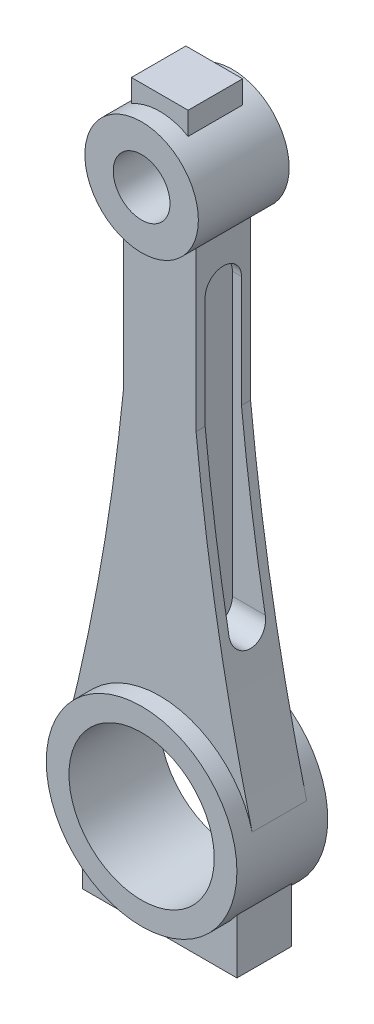
ISO-10303-21;
HEADER;
FILE_DESCRIPTION(('STEP AP214'),'2;1');
FILE_NAME('part.step','',(''),(''),'','','');
FILE_SCHEMA(('AUTOMOTIVE_DESIGN { 1 0 10303 214 1 1 1 1 }'));
ENDSEC;
DATA;
#1=APPLICATION_CONTEXT('core data for automotive mechanical design processes');
#2=APPLICATION_PROTOCOL_DEFINITION('international standard','automotive_design',2000,#1);
#3=PRODUCT_CONTEXT('',#1,'mechanical');
#4=PRODUCT('Part','Part','',(#3));
#5=PRODUCT_RELATED_PRODUCT_CATEGORY('part','',(#4));
#6=PRODUCT_DEFINITION_FORMATION('','',#4);
#7=PRODUCT_DEFINITION_CONTEXT('part definition',#1,'design');
#8=PRODUCT_DEFINITION('design','',#6,#7);
#9=PRODUCT_DEFINITION_SHAPE('','',#8);
#10=(LENGTH_UNIT() NAMED_UNIT(*) SI_UNIT(.MILLI.,.METRE.));
#11=(NAMED_UNIT(*) PLANE_ANGLE_UNIT() SI_UNIT($,.RADIAN.));
#12=(NAMED_UNIT(*) SI_UNIT($,.STERADIAN.) SOLID_ANGLE_UNIT());
#13=UNCERTAINTY_MEASURE_WITH_UNIT(LENGTH_MEASURE(1.E-05),#10,'distance_accuracy_value','');
#14=(GEOMETRIC_REPRESENTATION_CONTEXT(3) GLOBAL_UNCERTAINTY_ASSIGNED_CONTEXT((#13)) GLOBAL_UNIT_ASSIGNED_CONTEXT((#10,
#11,#12)) REPRESENTATION_CONTEXT('',''));
#15=CARTESIAN_POINT('',(0.,0.,0.));
#16=DIRECTION('',(0.,0.,1.));
#17=DIRECTION('',(1.,0.,0.));
#18=AXIS2_PLACEMENT_3D('',#15,#16,#17);
#19=CARTESIAN_POINT('',(485.609961130753,123.214585182197,6.));
#20=DIRECTION('',(0.,0.,-1.));
#21=DIRECTION('',(-1.,0.,0.));
#22=AXIS2_PLACEMENT_3D('',#19,#20,#21);
#23=CYLINDRICAL_SURFACE('',#22,479.997872601303);
#24=CARTESIAN_POINT('',(13.2367694972697,38.,-4.00000000000001));
#25=CARTESIAN_POINT('',(13.2573253969701,37.8860494352849,-4.00000976035226));
#26=CARTESIAN_POINT('',(13.2779224354355,37.7721113381636,-3.99513071215658));
#27=CARTESIAN_POINT('',(13.319052010866,37.5450569105739,-3.97567481804759));
#28=CARTESIAN_POINT('',(13.3395845492554,37.4319405618855,-3.96109818781723));
#29=CARTESIAN_POINT('',(13.3804339454306,37.2073506135732,-3.92233199810353));
#30=CARTESIAN_POINT('',(13.400750858069,37.0958765932167,-3.89814494664777));
#31=CARTESIAN_POINT('',(13.4410189163302,36.8753687223466,-3.84034033341715));
#32=CARTESIAN_POINT('',(13.4609700679236,36.7663348319936,-3.80672292573126));
#33=CARTESIAN_POINT('',(13.5200780992815,36.4439244011923,-3.69196014641538));
#34=CARTESIAN_POINT('',(13.5585015813534,36.235173020896,-3.59689277281704));
#35=CARTESIAN_POINT('',(13.632098352802,35.8366935291636,-3.37230858466554));
#36=CARTESIAN_POINT('',(13.667272642268,35.6469595626994,-3.24280241816722));
#37=CARTESIAN_POINT('',(13.7330571386943,35.2931579860129,-2.9537766741925));
#38=CARTESIAN_POINT('',(13.7636967389675,35.1289247082108,-2.79446705193569));
#39=CARTESIAN_POINT('',(13.8196728199873,34.829604441335,-2.4496372532524));
#40=CARTESIAN_POINT('',(13.8450088675232,34.6945198331874,-2.26411493776325));
#41=CARTESIAN_POINT('',(13.8891384890161,34.459656916781,-1.87529532046205));
#42=CARTESIAN_POINT('',(13.9080297897631,34.3593508125007,-1.6723279831204));
#43=CARTESIAN_POINT('',(13.9391556835637,34.194272351098,-1.25196201869724));
#44=CARTESIAN_POINT('',(13.9513913483916,34.1294942727913,-1.03456572147865));
#45=CARTESIAN_POINT('',(13.9686323879057,34.0382606103888,-0.59514241969184));
#46=CARTESIAN_POINT('',(13.9737473641708,34.0112240902681,-0.3732402045156));
#47=CARTESIAN_POINT('',(13.976920463438,33.9944488111073,0.0720189558451219));
#48=CARTESIAN_POINT('',(13.9749788383574,34.0047087206018,0.295375848814119));
#49=CARTESIAN_POINT('',(13.9641500072665,34.0619779758205,0.735421312346313));
#50=CARTESIAN_POINT('',(13.9553155030014,34.108708474586,0.952147568523602));
#51=CARTESIAN_POINT('',(13.9310734089588,34.2371227885846,1.37458854633153));
#52=CARTESIAN_POINT('',(13.9156657846489,34.3188067874484,1.58030321010563));
#53=CARTESIAN_POINT('',(13.8787244160883,34.5150475837361,1.97586856318911));
#54=CARTESIAN_POINT('',(13.8571654875107,34.6297395375632,2.1656497970732));
#55=CARTESIAN_POINT('',(13.8086626922934,34.8884296176294,2.52325934039983));
#56=CARTESIAN_POINT('',(13.7817187651744,35.0324280730121,2.69108740324973));
#57=CARTESIAN_POINT('',(13.7229065779148,35.3476889783691,3.00249885656432));
#58=CARTESIAN_POINT('',(13.690976829032,35.5192928072897,3.14572490036054));
#59=CARTESIAN_POINT('',(13.6234451288193,35.8834872510315,3.40145531805111));
#60=CARTESIAN_POINT('',(13.5878417058661,36.0760862779984,3.5139473139706));
#61=CARTESIAN_POINT('',(13.5134059314584,36.4802597435099,3.70694341195726));
#62=CARTESIAN_POINT('',(13.4745286819557,36.6921029237947,3.78686594783111));
#63=CARTESIAN_POINT('',(13.395259384564,37.1257849194858,3.90978182018943));
#64=CARTESIAN_POINT('',(13.354869587446,37.3476089746237,3.9528279173078));
#65=CARTESIAN_POINT('',(13.3014087361752,37.6424264183624,3.98463413203901));
#66=CARTESIAN_POINT('',(13.2884679030868,37.7138831380064,3.99039941838274));
#67=CARTESIAN_POINT('',(13.2626042087633,37.8568827970625,3.99807716864509));
#68=CARTESIAN_POINT('',(13.2496813536875,37.9284253921545,3.99999606304932));
#69=CARTESIAN_POINT('',(13.2367694972696,38.,3.99999999999999));
#70=B_SPLINE_CURVE_WITH_KNOTS('',3,(#24,#25,#26,#27,#28,#29,#30,#31,#32,#33,#34,#35,#36,#37,#38,
#39,#40,#41,#42,#43,#44,#45,#46,#47,#48,#49,#50,#51,#52,#53,#54,#55,#56,#57,#58,#59,#60,#61,#62,
#63,#64,#65,#66,#67,#68,#69),.UNSPECIFIED.,.F.,.F.,(4,2,2,2,2,2,2,2,2,2,2,2,2,2,2,2,2,2,2,2,2,2,
4),(0.,0.347257614046344,0.694507505028897,1.04166683381131,1.3888204904535,2.08292597724559,
2.776817104107,3.46599248667208,4.15522414127533,4.83348419636539,5.51163499711914,
6.17922776304851,6.8467966964564,7.50931094308357,8.17182867031698,8.8370987495961,
9.50237630099026,10.1766225425518,10.8511399342536,11.5372231801689,12.2223231713723,
12.4407940720576,12.6588994224666),.UNSPECIFIED.);
#71=CARTESIAN_POINT('',(13.2367694972697,38.,-4.00000000000001));
#72=VERTEX_POINT('',#71);
#73=CARTESIAN_POINT('',(13.2367694972697,38.,3.99999999999999));
#74=VERTEX_POINT('',#73);
#75=EDGE_CURVE('E11',#72,#74,#70,.T.);
#76=ORIENTED_EDGE('',*,*,#75,.T.);
#77=CARTESIAN_POINT('',(485.609961130753,123.214585182197,4.));
#78=DIRECTION('',(0.,0.,-1.));
#79=DIRECTION('',(0.,1.,0.));
#80=AXIS2_PLACEMENT_3D('',#77,#78,#79);
#81=CIRCLE('',#80,479.997872601303);
#82=CARTESIAN_POINT('',(8.00000000000001,75.3953136438507,4.));
#83=VERTEX_POINT('',#82);
#84=EDGE_CURVE('E244',#74,#83,#81,.T.);
#85=ORIENTED_EDGE('',*,*,#84,.T.);
#86=DIRECTION('',(0.,0.,-1.));
#87=VECTOR('',#86,1.);
#88=CARTESIAN_POINT('',(8.00000000000001,75.3953136438507,6.));
#89=LINE('',#88,#87);
#90=CARTESIAN_POINT('',(8.00000000000001,75.3953136438507,6.));
#91=VERTEX_POINT('',#90);
#92=EDGE_CURVE('E393',#91,#83,#89,.T.);
#93=ORIENTED_EDGE('',*,*,#92,.F.);
#94=CARTESIAN_POINT('',(485.609961130753,123.214585182197,6.));
#95=DIRECTION('',(0.,0.,1.));
#96=DIRECTION('',(1.,0.,0.));
#97=AXIS2_PLACEMENT_3D('',#94,#95,#96);
#98=CIRCLE('',#97,479.997872601303);
#99=CARTESIAN_POINT('',(20.3549949839034,5.16470514214195,6.));
#100=VERTEX_POINT('',#99);
#101=EDGE_CURVE('E346',#91,#100,#98,.T.);
#102=ORIENTED_EDGE('',*,*,#101,.T.);
#103=DIRECTION('',(0.,0.,-1.));
#104=VECTOR('',#103,1.);
#105=CARTESIAN_POINT('',(20.3549949839034,5.16470514214194,6.));
#106=LINE('',#105,#104);
#107=CARTESIAN_POINT('',(20.3549949839034,5.16470514214194,-6.));
#108=VERTEX_POINT('',#107);
#109=EDGE_CURVE('E362',#100,#108,#106,.T.);
#110=ORIENTED_EDGE('',*,*,#109,.T.);
#111=CARTESIAN_POINT('',(485.609961130753,123.214585182197,-6.));
#112=DIRECTION('',(0.,0.,1.));
#113=DIRECTION('',(1.,0.,0.));
#114=AXIS2_PLACEMENT_3D('',#111,#112,#113);
#115=CIRCLE('',#114,479.997872601303);
#116=CARTESIAN_POINT('',(8.00000000000001,75.3953136438507,-6.));
#117=VERTEX_POINT('',#116);
#118=EDGE_CURVE('E341',#117,#108,#115,.T.);
#119=ORIENTED_EDGE('',*,*,#118,.F.);
#120=CARTESIAN_POINT('',(8.00000000000001,75.3953136438507,-4.));
#121=VERTEX_POINT('',#120);
#122=EDGE_CURVE('E392',#121,#117,#89,.T.);
#123=ORIENTED_EDGE('',*,*,#122,.F.);
#124=CARTESIAN_POINT('',(485.609961130753,123.214585182197,-4.));
#125=DIRECTION('',(0.,0.,1.));
#126=DIRECTION('',(0.,-1.,0.));
#127=AXIS2_PLACEMENT_3D('',#124,#125,#126);
#128=CIRCLE('',#127,479.997872601303);
#129=EDGE_CURVE('E62',#121,#72,#128,.T.);
#130=ORIENTED_EDGE('',*,*,#129,.T.);
#131=EDGE_LOOP('',(#76,#85,#93,#102,#110,#119,#123,#130));
#132=FACE_BOUND('',#131,.T.);
#133=ADVANCED_FACE('F41',(#132),#23,.F.);
#134=CARTESIAN_POINT('',(8.00000000000002,0.,6.));
#135=DIRECTION('',(1.,0.,0.));
#136=DIRECTION('',(0.,1.,0.));
#137=AXIS2_PLACEMENT_3D('',#134,#135,#136);
#138=PLANE('',#137);
#139=ORIENTED_EDGE('',*,*,#92,.T.);
#140=DIRECTION('',(0.,1.,0.));
#141=VECTOR('',#140,1.);
#142=CARTESIAN_POINT('',(8.00000000000002,0.,3.99999999999999));
#143=LINE('',#142,#141);
#144=CARTESIAN_POINT('',(8.00000000000001,100.,4.));
#145=VERTEX_POINT('',#144);
#146=EDGE_CURVE('E55',#83,#145,#143,.T.);
#147=ORIENTED_EDGE('',*,*,#146,.T.);
#148=CARTESIAN_POINT('',(8.00000000000001,100.,0.));
#149=DIRECTION('',(1.,0.,0.));
#150=DIRECTION('',(0.,1.,0.));
#151=AXIS2_PLACEMENT_3D('',#148,#149,#150);
#152=CIRCLE('',#151,4.);
#153=CARTESIAN_POINT('',(8.00000000000001,100.,-4.));
#154=VERTEX_POINT('',#153);
#155=EDGE_CURVE('E216',#145,#154,#152,.F.);
#156=ORIENTED_EDGE('',*,*,#155,.T.);
#157=DIRECTION('',(0.,-1.,0.));
#158=VECTOR('',#157,1.);
#159=CARTESIAN_POINT('',(8.00000000000002,0.,-4.00000000000001));
#160=LINE('',#159,#158);
#161=EDGE_CURVE('E562',#154,#121,#160,.T.);
#162=ORIENTED_EDGE('',*,*,#161,.T.);
#163=ORIENTED_EDGE('',*,*,#122,.T.);
#164=DIRECTION('',(0.,-1.,0.));
#165=VECTOR('',#164,1.);
#166=CARTESIAN_POINT('',(8.00000000000002,0.,-6.));
#167=LINE('',#166,#165);
#168=CARTESIAN_POINT('',(8.,110.395313643851,-6.));
#169=VERTEX_POINT('',#168);
#170=EDGE_CURVE('E365',#169,#117,#167,.T.);
#171=ORIENTED_EDGE('',*,*,#170,.F.);
#172=DIRECTION('',(0.,0.,-1.));
#173=VECTOR('',#172,1.);
#174=CARTESIAN_POINT('',(8.,110.395313643851,6.));
#175=LINE('',#174,#173);
#176=CARTESIAN_POINT('',(8.,110.395313643851,6.));
#177=VERTEX_POINT('',#176);
#178=EDGE_CURVE('E390',#177,#169,#175,.T.);
#179=ORIENTED_EDGE('',*,*,#178,.F.);
#180=DIRECTION('',(0.,-1.,0.));
#181=VECTOR('',#180,1.);
#182=CARTESIAN_POINT('',(8.00000000000002,0.,6.));
#183=LINE('',#182,#181);
#184=EDGE_CURVE('E349',#177,#91,#183,.T.);
#185=ORIENTED_EDGE('',*,*,#184,.T.);
#186=EDGE_LOOP('',(#139,#147,#156,#162,#163,#171,#179,#185));
#187=FACE_BOUND('',#186,.T.);
#188=ADVANCED_FACE('F507',(#187),#138,.T.);
#189=CARTESIAN_POINT('',(0.,120.,10.));
#190=DIRECTION('',(0.,0.,-1.));
#191=DIRECTION('',(-1.,0.,0.));
#192=AXIS2_PLACEMENT_3D('',#189,#190,#191);
#193=CYLINDRICAL_SURFACE('',#192,6.25);
#194=CARTESIAN_POINT('',(0.,120.,10.));
#195=DIRECTION('',(0.,0.,1.));
#196=DIRECTION('',(1.,0.,0.));
#197=AXIS2_PLACEMENT_3D('',#194,#195,#196);
#198=CIRCLE('',#197,6.25);
#199=CARTESIAN_POINT('',(6.25,120.,10.));
#200=VERTEX_POINT('',#199);
#201=EDGE_CURVE('E397',#200,#200,#198,.T.);
#202=ORIENTED_EDGE('',*,*,#201,.T.);
#203=EDGE_LOOP('',(#202));
#204=FACE_BOUND('',#203,.T.);
#205=CARTESIAN_POINT('',(0.,120.,-10.));
#206=DIRECTION('',(0.,0.,1.));
#207=DIRECTION('',(1.,0.,0.));
#208=AXIS2_PLACEMENT_3D('',#205,#206,#207);
#209=CIRCLE('',#208,6.25);
#210=CARTESIAN_POINT('',(6.25,120.,-10.));
#211=VERTEX_POINT('',#210);
#212=EDGE_CURVE('E396',#211,#211,#209,.T.);
#213=ORIENTED_EDGE('',*,*,#212,.F.);
#214=EDGE_LOOP('',(#213));
#215=FACE_BOUND('',#214,.T.);
#216=ADVANCED_FACE('F43',(#204,#215),#193,.F.);
#217=CARTESIAN_POINT('',(0.,120.,10.));
#218=DIRECTION('',(0.,0.,-1.));
#219=DIRECTION('',(-1.,0.,0.));
#220=AXIS2_PLACEMENT_3D('',#217,#218,#219);
#221=CYLINDRICAL_SURFACE('',#220,12.5);
#222=DIRECTION('',(0.,0.,-1.));
#223=VECTOR('',#222,1.);
#224=CARTESIAN_POINT('',(6.25,130.825317547305,6.));
#225=LINE('',#224,#223);
#226=CARTESIAN_POINT('',(6.25,130.825317547305,6.));
#227=VERTEX_POINT('',#226);
#228=CARTESIAN_POINT('',(6.25,130.825317547305,-6.));
#229=VERTEX_POINT('',#228);
#230=EDGE_CURVE('E330',#227,#229,#225,.T.);
#231=ORIENTED_EDGE('',*,*,#230,.F.);
#232=CARTESIAN_POINT('',(0.,120.,6.));
#233=DIRECTION('',(0.,0.,1.));
#234=DIRECTION('',(1.,0.,0.));
#235=AXIS2_PLACEMENT_3D('',#232,#233,#234);
#236=CIRCLE('',#235,12.5);
#237=CARTESIAN_POINT('',(-6.25,130.825317547305,6.));
#238=VERTEX_POINT('',#237);
#239=EDGE_CURVE('E302',#227,#238,#236,.T.);
#240=ORIENTED_EDGE('',*,*,#239,.T.);
#241=DIRECTION('',(0.,0.,-1.));
#242=VECTOR('',#241,1.);
#243=CARTESIAN_POINT('',(-6.25,130.825317547305,6.));
#244=LINE('',#243,#242);
#245=CARTESIAN_POINT('',(-6.25,130.825317547305,-6.));
#246=VERTEX_POINT('',#245);
#247=EDGE_CURVE('E314',#238,#246,#244,.T.);
#248=ORIENTED_EDGE('',*,*,#247,.T.);
#249=CARTESIAN_POINT('',(0.,120.,-6.));
#250=DIRECTION('',(0.,0.,1.));
#251=DIRECTION('',(1.,0.,0.));
#252=AXIS2_PLACEMENT_3D('',#249,#250,#251);
#253=CIRCLE('',#252,12.5);
#254=EDGE_CURVE('E301',#229,#246,#253,.T.);
#255=ORIENTED_EDGE('',*,*,#254,.F.);
#256=EDGE_LOOP('',(#231,#240,#248,#255));
#257=FACE_BOUND('',#256,.T.);
#258=DIRECTION('',(0.,0.,-1.));
#259=VECTOR('',#258,1.);
#260=CARTESIAN_POINT('',(-7.99999999999999,110.395313643851,6.));
#261=LINE('',#260,#259);
#262=CARTESIAN_POINT('',(-7.99999999999999,110.395313643851,6.));
#263=VERTEX_POINT('',#262);
#264=CARTESIAN_POINT('',(-7.99999999999999,110.395313643851,-6.));
#265=VERTEX_POINT('',#264);
#266=EDGE_CURVE('E387',#263,#265,#261,.T.);
#267=ORIENTED_EDGE('',*,*,#266,.F.);
#268=CARTESIAN_POINT('',(0.,120.,6.));
#269=DIRECTION('',(0.,0.,1.));
#270=DIRECTION('',(1.,0.,0.));
#271=AXIS2_PLACEMENT_3D('',#268,#269,#270);
#272=CIRCLE('',#271,12.5);
#273=EDGE_CURVE('E353',#263,#177,#272,.T.);
#274=ORIENTED_EDGE('',*,*,#273,.T.);
#275=ORIENTED_EDGE('',*,*,#178,.T.);
#276=CARTESIAN_POINT('',(0.,120.,-6.));
#277=DIRECTION('',(0.,0.,1.));
#278=DIRECTION('',(1.,0.,0.));
#279=AXIS2_PLACEMENT_3D('',#276,#277,#278);
#280=CIRCLE('',#279,12.5);
#281=EDGE_CURVE('E368',#265,#169,#280,.T.);
#282=ORIENTED_EDGE('',*,*,#281,.F.);
#283=EDGE_LOOP('',(#267,#274,#275,#282));
#284=FACE_BOUND('',#283,.T.);
#285=CARTESIAN_POINT('',(0.,120.,10.));
#286=DIRECTION('',(0.,0.,1.));
#287=DIRECTION('',(1.,0.,0.));
#288=AXIS2_PLACEMENT_3D('',#285,#286,#287);
#289=CIRCLE('',#288,12.5);
#290=CARTESIAN_POINT('',(12.5,120.,10.));
#291=VERTEX_POINT('',#290);
#292=EDGE_CURVE('E400',#291,#291,#289,.T.);
#293=ORIENTED_EDGE('',*,*,#292,.F.);
#294=EDGE_LOOP('',(#293));
#295=FACE_BOUND('',#294,.T.);
#296=CARTESIAN_POINT('',(0.,120.,-10.));
#297=DIRECTION('',(0.,0.,1.));
#298=DIRECTION('',(1.,0.,0.));
#299=AXIS2_PLACEMENT_3D('',#296,#297,#298);
#300=CIRCLE('',#299,12.5);
#301=CARTESIAN_POINT('',(12.5,120.,-10.));
#302=VERTEX_POINT('',#301);
#303=EDGE_CURVE('E401',#302,#302,#300,.T.);
#304=ORIENTED_EDGE('',*,*,#303,.T.);
#305=EDGE_LOOP('',(#304));
#306=FACE_BOUND('',#305,.T.);
#307=ADVANCED_FACE('F521',(#257,#284,#295,#306),#221,.T.);
#308=CARTESIAN_POINT('',(0.,0.,10.));
#309=DIRECTION('',(0.,0.,1.));
#310=DIRECTION('',(1.,0.,0.));
#311=AXIS2_PLACEMENT_3D('',#308,#309,#310);
#312=PLANE('',#311);
#313=ORIENTED_EDGE('',*,*,#201,.F.);
#314=EDGE_LOOP('',(#313));
#315=FACE_BOUND('',#314,.T.);
#316=ORIENTED_EDGE('',*,*,#292,.T.);
#317=EDGE_LOOP('',(#316));
#318=FACE_BOUND('',#317,.T.);
#319=ADVANCED_FACE('F517',(#315,#318),#312,.T.);
#320=CARTESIAN_POINT('',(0.,0.,-10.));
#321=DIRECTION('',(0.,0.,1.));
#322=DIRECTION('',(1.,0.,0.));
#323=AXIS2_PLACEMENT_3D('',#320,#321,#322);
#324=PLANE('',#323);
#325=ORIENTED_EDGE('',*,*,#212,.T.);
#326=EDGE_LOOP('',(#325));
#327=FACE_BOUND('',#326,.T.);
#328=ORIENTED_EDGE('',*,*,#303,.F.);
#329=EDGE_LOOP('',(#328));
#330=FACE_BOUND('',#329,.T.);
#331=ADVANCED_FACE('F520',(#327,#330),#324,.F.);
#332=CARTESIAN_POINT('',(-7.99999999999998,0.,6.));
#333=DIRECTION('',(1.,0.,0.));
#334=DIRECTION('',(0.,1.,0.));
#335=AXIS2_PLACEMENT_3D('',#332,#333,#334);
#336=PLANE('',#335);
#337=DIRECTION('',(0.,0.,-1.));
#338=VECTOR('',#337,1.);
#339=CARTESIAN_POINT('',(-7.99999999999999,75.3953136438507,6.));
#340=LINE('',#339,#338);
#341=CARTESIAN_POINT('',(-7.9999999999999,75.3953136438507,-4.));
#342=VERTEX_POINT('',#341);
#343=CARTESIAN_POINT('',(-7.99999999999999,75.3953136438507,-6.));
#344=VERTEX_POINT('',#343);
#345=EDGE_CURVE('E383',#342,#344,#340,.T.);
#346=ORIENTED_EDGE('',*,*,#345,.F.);
#347=DIRECTION('',(0.,1.,0.));
#348=VECTOR('',#347,1.);
#349=CARTESIAN_POINT('',(-7.99999999999998,0.,-4.00000000000001));
#350=LINE('',#349,#348);
#351=CARTESIAN_POINT('',(-8.,100.,-4.));
#352=VERTEX_POINT('',#351);
#353=EDGE_CURVE('E268',#342,#352,#350,.T.);
#354=ORIENTED_EDGE('',*,*,#353,.T.);
#355=CARTESIAN_POINT('',(-7.99999999999999,100.,0.));
#356=DIRECTION('',(1.,0.,0.));
#357=DIRECTION('',(0.,1.,0.));
#358=AXIS2_PLACEMENT_3D('',#355,#356,#357);
#359=CIRCLE('',#358,4.);
#360=CARTESIAN_POINT('',(-8.,100.,4.));
#361=VERTEX_POINT('',#360);
#362=EDGE_CURVE('E561',#352,#361,#359,.T.);
#363=ORIENTED_EDGE('',*,*,#362,.T.);
#364=DIRECTION('',(0.,-1.,0.));
#365=VECTOR('',#364,1.);
#366=CARTESIAN_POINT('',(-7.99999999999998,0.,3.99999999999999));
#367=LINE('',#366,#365);
#368=CARTESIAN_POINT('',(-7.9999999999999,75.3953136438507,4.));
#369=VERTEX_POINT('',#368);
#370=EDGE_CURVE('E261',#361,#369,#367,.T.);
#371=ORIENTED_EDGE('',*,*,#370,.T.);
#372=CARTESIAN_POINT('',(-7.99999999999999,75.3953136438507,6.));
#373=VERTEX_POINT('',#372);
#374=EDGE_CURVE('E384',#373,#369,#340,.T.);
#375=ORIENTED_EDGE('',*,*,#374,.F.);
#376=DIRECTION('',(0.,-1.,0.));
#377=VECTOR('',#376,1.);
#378=CARTESIAN_POINT('',(-7.99999999999998,0.,6.));
#379=LINE('',#378,#377);
#380=EDGE_CURVE('E355',#263,#373,#379,.T.);
#381=ORIENTED_EDGE('',*,*,#380,.F.);
#382=ORIENTED_EDGE('',*,*,#266,.T.);
#383=DIRECTION('',(0.,-1.,0.));
#384=VECTOR('',#383,1.);
#385=CARTESIAN_POINT('',(-7.99999999999998,0.,-6.));
#386=LINE('',#385,#384);
#387=EDGE_CURVE('E371',#265,#344,#386,.T.);
#388=ORIENTED_EDGE('',*,*,#387,.T.);
#389=EDGE_LOOP('',(#346,#354,#363,#371,#375,#381,#382,#388));
#390=FACE_BOUND('',#389,.T.);
#391=ADVANCED_FACE('F524',(#390),#336,.F.);
#392=CARTESIAN_POINT('',(-485.609961130753,123.214585182196,6.));
#393=DIRECTION('',(0.,0.,-1.));
#394=DIRECTION('',(-1.,0.,0.));
#395=AXIS2_PLACEMENT_3D('',#392,#393,#394);
#396=CYLINDRICAL_SURFACE('',#395,479.997872601303);
#397=CARTESIAN_POINT('',(-13.2367694972696,38.,3.99999999999999));
#398=CARTESIAN_POINT('',(-13.2573253969701,37.8860494352849,4.00000976035224));
#399=CARTESIAN_POINT('',(-13.2779224354356,37.7721113381637,3.99513071215656));
#400=CARTESIAN_POINT('',(-13.319052010866,37.5450569105739,3.97567481804757));
#401=CARTESIAN_POINT('',(-13.3395845492554,37.4319405618855,3.96109818781721));
#402=CARTESIAN_POINT('',(-13.3804339454305,37.2073506135732,3.92233199810352));
#403=CARTESIAN_POINT('',(-13.400750858069,37.0958765932167,3.89814494664775));
#404=CARTESIAN_POINT('',(-13.4410189163301,36.8753687223466,3.84034033341713));
#405=CARTESIAN_POINT('',(-13.4609700679236,36.7663348319936,3.80672292573124));
#406=CARTESIAN_POINT('',(-13.5200780992815,36.4439244011923,3.69196014641536));
#407=CARTESIAN_POINT('',(-13.5585015813533,36.235173020896,3.59689277281703));
#408=CARTESIAN_POINT('',(-13.632098352802,35.8366935291636,3.37230858466553));
#409=CARTESIAN_POINT('',(-13.667272642268,35.6469595626994,3.2428024181672));
#410=CARTESIAN_POINT('',(-13.7330571386942,35.293157986013,2.95377667419248));
#411=CARTESIAN_POINT('',(-13.7636967389674,35.1289247082108,2.79446705193568));
#412=CARTESIAN_POINT('',(-13.8196728199872,34.829604441335,2.44963725325238));
#413=CARTESIAN_POINT('',(-13.8450088675232,34.6945198331874,2.26411493776323));
#414=CARTESIAN_POINT('',(-13.889138489016,34.459656916781,1.87529532046203));
#415=CARTESIAN_POINT('',(-13.908029789763,34.3593508125007,1.67232798312038));
#416=CARTESIAN_POINT('',(-13.9391556835636,34.194272351098,1.25196201869722));
#417=CARTESIAN_POINT('',(-13.9513913483916,34.1294942727913,1.03456572147864));
#418=CARTESIAN_POINT('',(-13.9686323879057,34.0382606103888,0.595142419691829));
#419=CARTESIAN_POINT('',(-13.9737473641709,34.0112240902681,0.373240204515586));
#420=CARTESIAN_POINT('',(-13.976920463438,33.9944488111074,-0.0720189558451381));
#421=CARTESIAN_POINT('',(-13.9749788383574,34.0047087206018,-0.295375848814136));
#422=CARTESIAN_POINT('',(-13.9641500072665,34.0619779758205,-0.735421312346332));
#423=CARTESIAN_POINT('',(-13.9553155030014,34.108708474586,-0.952147568523621));
#424=CARTESIAN_POINT('',(-13.9310734089588,34.2371227885846,-1.37458854633155));
#425=CARTESIAN_POINT('',(-13.9156657846489,34.3188067874484,-1.58030321010565));
#426=CARTESIAN_POINT('',(-13.8787244160882,34.5150475837361,-1.97586856318913));
#427=CARTESIAN_POINT('',(-13.8571654875106,34.6297395375632,-2.16564979707322));
#428=CARTESIAN_POINT('',(-13.8086626922933,34.8884296176294,-2.52325934039984));
#429=CARTESIAN_POINT('',(-13.7817187651744,35.0324280730121,-2.69108740324974));
#430=CARTESIAN_POINT('',(-13.7229065779147,35.3476889783691,-3.00249885656434));
#431=CARTESIAN_POINT('',(-13.690976829032,35.5192928072897,-3.14572490036057));
#432=CARTESIAN_POINT('',(-13.6234451288192,35.8834872510315,-3.40145531805113));
#433=CARTESIAN_POINT('',(-13.587841705866,36.0760862779984,-3.51394731397062));
#434=CARTESIAN_POINT('',(-13.5134059314583,36.4802597435099,-3.70694341195728));
#435=CARTESIAN_POINT('',(-13.4745286819557,36.6921029237947,-3.78686594783113));
#436=CARTESIAN_POINT('',(-13.395259384564,37.1257849194858,-3.90978182018945));
#437=CARTESIAN_POINT('',(-13.354869587446,37.3476089746238,-3.95282791730782));
#438=CARTESIAN_POINT('',(-13.3014087361752,37.6424264183625,-3.98463413203903));
#439=CARTESIAN_POINT('',(-13.2884679030867,37.7138831380064,-3.99039941838276));
#440=CARTESIAN_POINT('',(-13.2626042087633,37.8568827970625,-3.99807716864511));
#441=CARTESIAN_POINT('',(-13.2496813536875,37.9284253921545,-3.99999606304934));
#442=CARTESIAN_POINT('',(-13.2367694972696,38.,-4.00000000000001));
#443=B_SPLINE_CURVE_WITH_KNOTS('',3,(#397,#398,#399,#400,#401,#402,#403,#404,#405,#406,#407,
#408,#409,#410,#411,#412,#413,#414,#415,#416,#417,#418,#419,#420,#421,#422,#423,#424,#425,#426,
#427,#428,#429,#430,#431,#432,#433,#434,#435,#436,#437,#438,#439,#440,#441,#442),.UNSPECIFIED.,
.F.,.F.,(4,2,2,2,2,2,2,2,2,2,2,2,2,2,2,2,2,2,2,2,2,2,4),(0.,0.347257614046346,0.694507505028888,
1.04166683381131,1.3888204904535,2.08292597724559,2.776817104107,3.46599248667208,
4.15522414127534,4.8334841963654,5.51163499711914,6.17922776304851,6.8467966964564,
7.50931094308358,8.17182867031698,8.8370987495961,9.50237630099026,10.1766225425519,
10.8511399342536,11.5372231801689,12.2223231713723,12.4407940720576,12.6588994224666),.UNSPECIFIED.);
#444=CARTESIAN_POINT('',(-13.2367694972697,38.,3.99999999999999));
#445=VERTEX_POINT('',#444);
#446=CARTESIAN_POINT('',(-13.2367694972696,38.,-4.00000000000001));
#447=VERTEX_POINT('',#446);
#448=EDGE_CURVE('E411',#445,#447,#443,.T.);
#449=ORIENTED_EDGE('',*,*,#448,.T.);
#450=CARTESIAN_POINT('',(-485.609961130753,123.214585182196,-4.));
#451=DIRECTION('',(0.,0.,-1.));
#452=DIRECTION('',(0.,1.,0.));
#453=AXIS2_PLACEMENT_3D('',#450,#451,#452);
#454=CIRCLE('',#453,479.997872601303);
#455=EDGE_CURVE('E420',#447,#342,#454,.F.);
#456=ORIENTED_EDGE('',*,*,#455,.T.);
#457=ORIENTED_EDGE('',*,*,#345,.T.);
#458=CARTESIAN_POINT('',(-485.609961130753,123.214585182196,-6.));
#459=DIRECTION('',(0.,0.,1.));
#460=DIRECTION('',(1.,0.,0.));
#461=AXIS2_PLACEMENT_3D('',#458,#459,#460);
#462=CIRCLE('',#461,479.997872601303);
#463=CARTESIAN_POINT('',(-20.3549949839034,5.16470514214194,-6.));
#464=VERTEX_POINT('',#463);
#465=EDGE_CURVE('E374',#344,#464,#462,.F.);
#466=ORIENTED_EDGE('',*,*,#465,.T.);
#467=DIRECTION('',(0.,0.,-1.));
#468=VECTOR('',#467,1.);
#469=CARTESIAN_POINT('',(-20.3549949839034,5.16470514214194,6.));
#470=LINE('',#469,#468);
#471=CARTESIAN_POINT('',(-20.3549949839034,5.16470514214194,6.));
#472=VERTEX_POINT('',#471);
#473=EDGE_CURVE('E381',#472,#464,#470,.T.);
#474=ORIENTED_EDGE('',*,*,#473,.F.);
#475=CARTESIAN_POINT('',(-485.609961130753,123.214585182196,6.));
#476=DIRECTION('',(0.,0.,1.));
#477=DIRECTION('',(1.,0.,0.));
#478=AXIS2_PLACEMENT_3D('',#475,#476,#477);
#479=CIRCLE('',#478,479.997872601303);
#480=EDGE_CURVE('E357',#373,#472,#479,.F.);
#481=ORIENTED_EDGE('',*,*,#480,.F.);
#482=ORIENTED_EDGE('',*,*,#374,.T.);
#483=CARTESIAN_POINT('',(-485.609961130753,123.214585182196,4.));
#484=DIRECTION('',(0.,0.,1.));
#485=DIRECTION('',(0.,-1.,0.));
#486=AXIS2_PLACEMENT_3D('',#483,#484,#485);
#487=CIRCLE('',#486,479.997872601303);
#488=EDGE_CURVE('E404',#369,#445,#487,.F.);
#489=ORIENTED_EDGE('',*,*,#488,.T.);
#490=EDGE_LOOP('',(#449,#456,#457,#466,#474,#481,#482,#489));
#491=FACE_BOUND('',#490,.T.);
#492=ADVANCED_FACE('F422',(#491),#396,.F.);
#493=CARTESIAN_POINT('',(0.,0.,6.));
#494=DIRECTION('',(0.,0.,1.));
#495=DIRECTION('',(1.,0.,0.));
#496=AXIS2_PLACEMENT_3D('',#493,#494,#495);
#497=PLANE('',#496);
#498=ORIENTED_EDGE('',*,*,#101,.F.);
#499=ORIENTED_EDGE('',*,*,#184,.F.);
#500=ORIENTED_EDGE('',*,*,#273,.F.);
#501=ORIENTED_EDGE('',*,*,#380,.T.);
#502=ORIENTED_EDGE('',*,*,#480,.T.);
#503=CARTESIAN_POINT('',(0.,0.,6.));
#504=DIRECTION('',(0.,0.,1.));
#505=DIRECTION('',(1.,0.,0.));
#506=AXIS2_PLACEMENT_3D('',#503,#504,#505);
#507=CIRCLE('',#506,21.);
#508=EDGE_CURVE('E360',#100,#472,#507,.T.);
#509=ORIENTED_EDGE('',*,*,#508,.F.);
#510=EDGE_LOOP('',(#498,#499,#500,#501,#502,#509));
#511=FACE_BOUND('',#510,.T.);
#512=ADVANCED_FACE('F499',(#511),#497,.T.);
#513=CARTESIAN_POINT('',(0.,0.,-6.));
#514=DIRECTION('',(0.,0.,1.));
#515=DIRECTION('',(1.,0.,0.));
#516=AXIS2_PLACEMENT_3D('',#513,#514,#515);
#517=PLANE('',#516);
#518=ORIENTED_EDGE('',*,*,#118,.T.);
#519=CARTESIAN_POINT('',(0.,0.,-6.));
#520=DIRECTION('',(0.,0.,1.));
#521=DIRECTION('',(1.,0.,0.));
#522=AXIS2_PLACEMENT_3D('',#519,#520,#521);
#523=CIRCLE('',#522,21.);
#524=EDGE_CURVE('E350',#108,#464,#523,.T.);
#525=ORIENTED_EDGE('',*,*,#524,.T.);
#526=ORIENTED_EDGE('',*,*,#465,.F.);
#527=ORIENTED_EDGE('',*,*,#387,.F.);
#528=ORIENTED_EDGE('',*,*,#281,.T.);
#529=ORIENTED_EDGE('',*,*,#170,.T.);
#530=EDGE_LOOP('',(#518,#525,#526,#527,#528,#529));
#531=FACE_BOUND('',#530,.T.);
#532=ADVANCED_FACE('F497',(#531),#517,.F.);
#533=CARTESIAN_POINT('',(0.,0.,10.));
#534=DIRECTION('',(0.,0.,-1.));
#535=DIRECTION('',(-1.,0.,0.));
#536=AXIS2_PLACEMENT_3D('',#533,#534,#535);
#537=CYLINDRICAL_SURFACE('',#536,16.);
#538=CARTESIAN_POINT('',(0.,0.,10.));
#539=DIRECTION('',(0.,0.,1.));
#540=DIRECTION('',(1.,0.,0.));
#541=AXIS2_PLACEMENT_3D('',#538,#539,#540);
#542=CIRCLE('',#541,16.);
#543=CARTESIAN_POINT('',(16.,0.,10.));
#544=VERTEX_POINT('',#543);
#545=EDGE_CURVE('E334',#544,#544,#542,.T.);
#546=ORIENTED_EDGE('',*,*,#545,.T.);
#547=EDGE_LOOP('',(#546));
#548=FACE_BOUND('',#547,.T.);
#549=CARTESIAN_POINT('',(0.,0.,-10.));
#550=DIRECTION('',(0.,0.,1.));
#551=DIRECTION('',(1.,0.,0.));
#552=AXIS2_PLACEMENT_3D('',#549,#550,#551);
#553=CIRCLE('',#552,16.);
#554=CARTESIAN_POINT('',(16.,0.,-10.));
#555=VERTEX_POINT('',#554);
#556=EDGE_CURVE('E333',#555,#555,#553,.T.);
#557=ORIENTED_EDGE('',*,*,#556,.F.);
#558=EDGE_LOOP('',(#557));
#559=FACE_BOUND('',#558,.T.);
#560=ADVANCED_FACE('F493',(#548,#559),#537,.F.);
#561=CARTESIAN_POINT('',(0.,0.,10.));
#562=DIRECTION('',(0.,0.,-1.));
#563=DIRECTION('',(-1.,0.,0.));
#564=AXIS2_PLACEMENT_3D('',#561,#562,#563);
#565=CYLINDRICAL_SURFACE('',#564,21.);
#566=DIRECTION('',(0.,0.,-1.));
#567=VECTOR('',#566,1.);
#568=CARTESIAN_POINT('',(-17.,-12.328828005938,6.));
#569=LINE('',#568,#567);
#570=CARTESIAN_POINT('',(-17.,-12.328828005938,6.));
#571=VERTEX_POINT('',#570);
#572=CARTESIAN_POINT('',(-17.,-12.328828005938,-6.));
#573=VERTEX_POINT('',#572);
#574=EDGE_CURVE('E298',#571,#573,#569,.T.);
#575=ORIENTED_EDGE('',*,*,#574,.F.);
#576=CARTESIAN_POINT('',(0.,0.,6.));
#577=DIRECTION('',(0.,0.,1.));
#578=DIRECTION('',(1.,0.,0.));
#579=AXIS2_PLACEMENT_3D('',#576,#577,#578);
#580=CIRCLE('',#579,21.);
#581=CARTESIAN_POINT('',(17.,-12.328828005938,6.));
#582=VERTEX_POINT('',#581);
#583=EDGE_CURVE('E272',#571,#582,#580,.T.);
#584=ORIENTED_EDGE('',*,*,#583,.T.);
#585=DIRECTION('',(0.,0.,-1.));
#586=VECTOR('',#585,1.);
#587=CARTESIAN_POINT('',(17.,-12.328828005938,6.));
#588=LINE('',#587,#586);
#589=CARTESIAN_POINT('',(17.,-12.328828005938,-6.));
#590=VERTEX_POINT('',#589);
#591=EDGE_CURVE('E282',#582,#590,#588,.T.);
#592=ORIENTED_EDGE('',*,*,#591,.T.);
#593=CARTESIAN_POINT('',(0.,0.,-6.));
#594=DIRECTION('',(0.,0.,1.));
#595=DIRECTION('',(1.,0.,0.));
#596=AXIS2_PLACEMENT_3D('',#593,#594,#595);
#597=CIRCLE('',#596,21.);
#598=EDGE_CURVE('E271',#573,#590,#597,.T.);
#599=ORIENTED_EDGE('',*,*,#598,.F.);
#600=EDGE_LOOP('',(#575,#584,#592,#599));
#601=FACE_BOUND('',#600,.T.);
#602=ORIENTED_EDGE('',*,*,#508,.T.);
#603=ORIENTED_EDGE('',*,*,#473,.T.);
#604=ORIENTED_EDGE('',*,*,#524,.F.);
#605=ORIENTED_EDGE('',*,*,#109,.F.);
#606=EDGE_LOOP('',(#602,#603,#604,#605));
#607=FACE_BOUND('',#606,.T.);
#608=CARTESIAN_POINT('',(0.,0.,10.));
#609=DIRECTION('',(0.,0.,1.));
#610=DIRECTION('',(1.,0.,0.));
#611=AXIS2_PLACEMENT_3D('',#608,#609,#610);
#612=CIRCLE('',#611,21.);
#613=CARTESIAN_POINT('',(21.,0.,10.));
#614=VERTEX_POINT('',#613);
#615=EDGE_CURVE('E337',#614,#614,#612,.T.);
#616=ORIENTED_EDGE('',*,*,#615,.F.);
#617=EDGE_LOOP('',(#616));
#618=FACE_BOUND('',#617,.T.);
#619=CARTESIAN_POINT('',(0.,0.,-10.));
#620=DIRECTION('',(0.,0.,1.));
#621=DIRECTION('',(1.,0.,0.));
#622=AXIS2_PLACEMENT_3D('',#619,#620,#621);
#623=CIRCLE('',#622,21.);
#624=CARTESIAN_POINT('',(21.,0.,-10.));
#625=VERTEX_POINT('',#624);
#626=EDGE_CURVE('E338',#625,#625,#623,.T.);
#627=ORIENTED_EDGE('',*,*,#626,.T.);
#628=EDGE_LOOP('',(#627));
#629=FACE_BOUND('',#628,.T.);
#630=ADVANCED_FACE('F486',(#601,#607,#618,#629),#565,.T.);
#631=CARTESIAN_POINT('',(0.,0.,10.));
#632=DIRECTION('',(0.,0.,1.));
#633=DIRECTION('',(1.,0.,0.));
#634=AXIS2_PLACEMENT_3D('',#631,#632,#633);
#635=PLANE('',#634);
#636=ORIENTED_EDGE('',*,*,#545,.F.);
#637=EDGE_LOOP('',(#636));
#638=FACE_BOUND('',#637,.T.);
#639=ORIENTED_EDGE('',*,*,#615,.T.);
#640=EDGE_LOOP('',(#639));
#641=FACE_BOUND('',#640,.T.);
#642=ADVANCED_FACE('F483',(#638,#641),#635,.T.);
#643=CARTESIAN_POINT('',(0.,0.,-10.));
#644=DIRECTION('',(0.,0.,1.));
#645=DIRECTION('',(1.,0.,0.));
#646=AXIS2_PLACEMENT_3D('',#643,#644,#645);
#647=PLANE('',#646);
#648=ORIENTED_EDGE('',*,*,#556,.T.);
#649=EDGE_LOOP('',(#648));
#650=FACE_BOUND('',#649,.T.);
#651=ORIENTED_EDGE('',*,*,#626,.F.);
#652=EDGE_LOOP('',(#651));
#653=FACE_BOUND('',#652,.T.);
#654=ADVANCED_FACE('F481',(#650,#653),#647,.F.);
#655=CARTESIAN_POINT('',(6.25000000000005,0.,6.));
#656=DIRECTION('',(1.,0.,0.));
#657=DIRECTION('',(0.,1.,0.));
#658=AXIS2_PLACEMENT_3D('',#655,#656,#657);
#659=PLANE('',#658);
#660=DIRECTION('',(0.,-1.,0.));
#661=VECTOR('',#660,1.);
#662=CARTESIAN_POINT('',(6.25000000000005,0.,-6.));
#663=LINE('',#662,#661);
#664=CARTESIAN_POINT('',(6.25,135.825317547305,-6.));
#665=VERTEX_POINT('',#664);
#666=EDGE_CURVE('E317',#665,#229,#663,.T.);
#667=ORIENTED_EDGE('',*,*,#666,.F.);
#668=DIRECTION('',(0.,0.,-1.));
#669=VECTOR('',#668,1.);
#670=CARTESIAN_POINT('',(6.25,135.825317547305,6.));
#671=LINE('',#670,#669);
#672=CARTESIAN_POINT('',(6.25,135.825317547305,6.));
#673=VERTEX_POINT('',#672);
#674=EDGE_CURVE('E328',#673,#665,#671,.T.);
#675=ORIENTED_EDGE('',*,*,#674,.F.);
#676=DIRECTION('',(0.,-1.,0.));
#677=VECTOR('',#676,1.);
#678=CARTESIAN_POINT('',(6.25000000000005,0.,6.));
#679=LINE('',#678,#677);
#680=EDGE_CURVE('E304',#673,#227,#679,.T.);
#681=ORIENTED_EDGE('',*,*,#680,.T.);
#682=ORIENTED_EDGE('',*,*,#230,.T.);
#683=EDGE_LOOP('',(#667,#675,#681,#682));
#684=FACE_BOUND('',#683,.T.);
#685=ADVANCED_FACE('F477',(#684),#659,.T.);
#686=CARTESIAN_POINT('',(0.,135.825317547305,6.));
#687=DIRECTION('',(0.,1.,0.));
#688=DIRECTION('',(0.,0.,1.));
#689=AXIS2_PLACEMENT_3D('',#686,#687,#688);
#690=PLANE('',#689);
#691=DIRECTION('',(1.,0.,0.));
#692=VECTOR('',#691,1.);
#693=CARTESIAN_POINT('',(0.,135.825317547305,-6.));
#694=LINE('',#693,#692);
#695=CARTESIAN_POINT('',(-6.25,135.825317547305,-6.));
#696=VERTEX_POINT('',#695);
#697=EDGE_CURVE('E320',#696,#665,#694,.T.);
#698=ORIENTED_EDGE('',*,*,#697,.F.);
#699=DIRECTION('',(0.,0.,-1.));
#700=VECTOR('',#699,1.);
#701=CARTESIAN_POINT('',(-6.25,135.825317547305,6.));
#702=LINE('',#701,#700);
#703=CARTESIAN_POINT('',(-6.25,135.825317547305,6.));
#704=VERTEX_POINT('',#703);
#705=EDGE_CURVE('E326',#704,#696,#702,.T.);
#706=ORIENTED_EDGE('',*,*,#705,.F.);
#707=DIRECTION('',(1.,0.,0.));
#708=VECTOR('',#707,1.);
#709=CARTESIAN_POINT('',(0.,135.825317547305,6.));
#710=LINE('',#709,#708);
#711=EDGE_CURVE('E308',#704,#673,#710,.T.);
#712=ORIENTED_EDGE('',*,*,#711,.T.);
#713=ORIENTED_EDGE('',*,*,#674,.T.);
#714=EDGE_LOOP('',(#698,#706,#712,#713));
#715=FACE_BOUND('',#714,.T.);
#716=ADVANCED_FACE('F473',(#715),#690,.T.);
#717=CARTESIAN_POINT('',(-6.25,0.,6.));
#718=DIRECTION('',(1.,0.,0.));
#719=DIRECTION('',(0.,0.,-1.));
#720=AXIS2_PLACEMENT_3D('',#717,#718,#719);
#721=PLANE('',#720);
#722=DIRECTION('',(0.,-1.,0.));
#723=VECTOR('',#722,1.);
#724=CARTESIAN_POINT('',(-6.25,0.,-6.));
#725=LINE('',#724,#723);
#726=EDGE_CURVE('E305',#696,#246,#725,.T.);
#727=ORIENTED_EDGE('',*,*,#726,.T.);
#728=ORIENTED_EDGE('',*,*,#247,.F.);
#729=DIRECTION('',(0.,-1.,0.));
#730=VECTOR('',#729,1.);
#731=CARTESIAN_POINT('',(-6.25,0.,6.));
#732=LINE('',#731,#730);
#733=EDGE_CURVE('E311',#704,#238,#732,.T.);
#734=ORIENTED_EDGE('',*,*,#733,.F.);
#735=ORIENTED_EDGE('',*,*,#705,.T.);
#736=EDGE_LOOP('',(#727,#728,#734,#735));
#737=FACE_BOUND('',#736,.T.);
#738=ADVANCED_FACE('F466',(#737),#721,.F.);
#739=CARTESIAN_POINT('',(0.,0.,6.));
#740=DIRECTION('',(0.,0.,1.));
#741=DIRECTION('',(1.,0.,0.));
#742=AXIS2_PLACEMENT_3D('',#739,#740,#741);
#743=PLANE('',#742);
#744=ORIENTED_EDGE('',*,*,#239,.F.);
#745=ORIENTED_EDGE('',*,*,#680,.F.);
#746=ORIENTED_EDGE('',*,*,#711,.F.);
#747=ORIENTED_EDGE('',*,*,#733,.T.);
#748=EDGE_LOOP('',(#744,#745,#746,#747));
#749=FACE_BOUND('',#748,.T.);
#750=ADVANCED_FACE('F463',(#749),#743,.T.);
#751=CARTESIAN_POINT('',(0.,0.,-6.));
#752=DIRECTION('',(0.,0.,1.));
#753=DIRECTION('',(1.,0.,0.));
#754=AXIS2_PLACEMENT_3D('',#751,#752,#753);
#755=PLANE('',#754);
#756=ORIENTED_EDGE('',*,*,#254,.T.);
#757=ORIENTED_EDGE('',*,*,#726,.F.);
#758=ORIENTED_EDGE('',*,*,#697,.T.);
#759=ORIENTED_EDGE('',*,*,#666,.T.);
#760=EDGE_LOOP('',(#756,#757,#758,#759));
#761=FACE_BOUND('',#760,.T.);
#762=ADVANCED_FACE('F461',(#761),#755,.F.);
#763=CARTESIAN_POINT('',(-17.,0.,6.));
#764=DIRECTION('',(1.,0.,0.));
#765=DIRECTION('',(0.,0.,-1.));
#766=AXIS2_PLACEMENT_3D('',#763,#764,#765);
#767=PLANE('',#766);
#768=DIRECTION('',(0.,-1.,0.));
#769=VECTOR('',#768,1.);
#770=CARTESIAN_POINT('',(-17.,0.,-6.));
#771=LINE('',#770,#769);
#772=CARTESIAN_POINT('',(-17.,-24.328828005938,-6.));
#773=VERTEX_POINT('',#772);
#774=EDGE_CURVE('E285',#573,#773,#771,.T.);
#775=ORIENTED_EDGE('',*,*,#774,.T.);
#776=DIRECTION('',(0.,0.,-1.));
#777=VECTOR('',#776,1.);
#778=CARTESIAN_POINT('',(-17.,-24.328828005938,6.));
#779=LINE('',#778,#777);
#780=CARTESIAN_POINT('',(-17.,-24.328828005938,6.));
#781=VERTEX_POINT('',#780);
#782=EDGE_CURVE('E295',#781,#773,#779,.T.);
#783=ORIENTED_EDGE('',*,*,#782,.F.);
#784=DIRECTION('',(0.,-1.,0.));
#785=VECTOR('',#784,1.);
#786=CARTESIAN_POINT('',(-17.,0.,6.));
#787=LINE('',#786,#785);
#788=EDGE_CURVE('E274',#571,#781,#787,.T.);
#789=ORIENTED_EDGE('',*,*,#788,.F.);
#790=ORIENTED_EDGE('',*,*,#574,.T.);
#791=EDGE_LOOP('',(#775,#783,#789,#790));
#792=FACE_BOUND('',#791,.T.);
#793=ADVANCED_FACE('F457',(#792),#767,.F.);
#794=CARTESIAN_POINT('',(0.,-24.328828005938,6.));
#795=DIRECTION('',(0.,1.,0.));
#796=DIRECTION('',(-1.,0.,0.));
#797=AXIS2_PLACEMENT_3D('',#794,#795,#796);
#798=PLANE('',#797);
#799=DIRECTION('',(1.,0.,0.));
#800=VECTOR('',#799,1.);
#801=CARTESIAN_POINT('',(0.,-24.328828005938,-6.));
#802=LINE('',#801,#800);
#803=CARTESIAN_POINT('',(17.,-24.3288280059379,-6.));
#804=VERTEX_POINT('',#803);
#805=EDGE_CURVE('E287',#773,#804,#802,.T.);
#806=ORIENTED_EDGE('',*,*,#805,.T.);
#807=DIRECTION('',(0.,0.,-1.));
#808=VECTOR('',#807,1.);
#809=CARTESIAN_POINT('',(17.,-24.3288280059379,6.));
#810=LINE('',#809,#808);
#811=CARTESIAN_POINT('',(17.,-24.3288280059379,6.));
#812=VERTEX_POINT('',#811);
#813=EDGE_CURVE('E292',#812,#804,#810,.T.);
#814=ORIENTED_EDGE('',*,*,#813,.F.);
#815=DIRECTION('',(1.,0.,0.));
#816=VECTOR('',#815,1.);
#817=CARTESIAN_POINT('',(0.,-24.328828005938,6.));
#818=LINE('',#817,#816);
#819=EDGE_CURVE('E277',#781,#812,#818,.T.);
#820=ORIENTED_EDGE('',*,*,#819,.F.);
#821=ORIENTED_EDGE('',*,*,#782,.T.);
#822=EDGE_LOOP('',(#806,#814,#820,#821));
#823=FACE_BOUND('',#822,.T.);
#824=ADVANCED_FACE('F453',(#823),#798,.F.);
#825=CARTESIAN_POINT('',(17.,0.,6.));
#826=DIRECTION('',(-1.,0.,0.));
#827=DIRECTION('',(0.,0.,1.));
#828=AXIS2_PLACEMENT_3D('',#825,#826,#827);
#829=PLANE('',#828);
#830=DIRECTION('',(0.,1.,0.));
#831=VECTOR('',#830,1.);
#832=CARTESIAN_POINT('',(17.,0.,-6.));
#833=LINE('',#832,#831);
#834=EDGE_CURVE('E275',#804,#590,#833,.T.);
#835=ORIENTED_EDGE('',*,*,#834,.T.);
#836=ORIENTED_EDGE('',*,*,#591,.F.);
#837=DIRECTION('',(0.,1.,0.));
#838=VECTOR('',#837,1.);
#839=CARTESIAN_POINT('',(17.,0.,6.));
#840=LINE('',#839,#838);
#841=EDGE_CURVE('E279',#812,#582,#840,.T.);
#842=ORIENTED_EDGE('',*,*,#841,.F.);
#843=ORIENTED_EDGE('',*,*,#813,.T.);
#844=EDGE_LOOP('',(#835,#836,#842,#843));
#845=FACE_BOUND('',#844,.T.);
#846=ADVANCED_FACE('F446',(#845),#829,.F.);
#847=CARTESIAN_POINT('',(0.,0.,6.));
#848=DIRECTION('',(0.,0.,1.));
#849=DIRECTION('',(1.,0.,0.));
#850=AXIS2_PLACEMENT_3D('',#847,#848,#849);
#851=PLANE('',#850);
#852=ORIENTED_EDGE('',*,*,#583,.F.);
#853=ORIENTED_EDGE('',*,*,#788,.T.);
#854=ORIENTED_EDGE('',*,*,#819,.T.);
#855=ORIENTED_EDGE('',*,*,#841,.T.);
#856=EDGE_LOOP('',(#852,#853,#854,#855));
#857=FACE_BOUND('',#856,.T.);
#858=ADVANCED_FACE('F443',(#857),#851,.T.);
#859=CARTESIAN_POINT('',(0.,0.,-6.));
#860=DIRECTION('',(0.,0.,1.));
#861=DIRECTION('',(1.,0.,0.));
#862=AXIS2_PLACEMENT_3D('',#859,#860,#861);
#863=PLANE('',#862);
#864=ORIENTED_EDGE('',*,*,#598,.T.);
#865=ORIENTED_EDGE('',*,*,#834,.F.);
#866=ORIENTED_EDGE('',*,*,#805,.F.);
#867=ORIENTED_EDGE('',*,*,#774,.F.);
#868=EDGE_LOOP('',(#864,#865,#866,#867));
#869=FACE_BOUND('',#868,.T.);
#870=ADVANCED_FACE('F441',(#869),#863,.F.);
#871=CARTESIAN_POINT('',(-21.,100.,0.));
#872=DIRECTION('',(1.,0.,0.));
#873=DIRECTION('',(0.,0.,-1.));
#874=AXIS2_PLACEMENT_3D('',#871,#872,#873);
#875=CYLINDRICAL_SURFACE('',#874,4.);
#876=DIRECTION('',(1.,0.,0.));
#877=VECTOR('',#876,1.);
#878=CARTESIAN_POINT('',(-21.,100.,-4.));
#879=LINE('',#878,#877);
#880=CARTESIAN_POINT('',(-6.,100.,-4.));
#881=VERTEX_POINT('',#880);
#882=EDGE_CURVE('E259',#352,#881,#879,.T.);
#883=ORIENTED_EDGE('',*,*,#882,.T.);
#884=CARTESIAN_POINT('',(-6.,100.,0.));
#885=DIRECTION('',(1.,0.,0.));
#886=DIRECTION('',(0.,0.,-1.));
#887=AXIS2_PLACEMENT_3D('',#884,#885,#886);
#888=CIRCLE('',#887,4.);
#889=CARTESIAN_POINT('',(-6.,100.,4.));
#890=VERTEX_POINT('',#889);
#891=EDGE_CURVE('E247',#881,#890,#888,.T.);
#892=ORIENTED_EDGE('',*,*,#891,.T.);
#893=DIRECTION('',(1.,0.,0.));
#894=VECTOR('',#893,1.);
#895=CARTESIAN_POINT('',(-21.,100.,4.));
#896=LINE('',#895,#894);
#897=EDGE_CURVE('E258',#361,#890,#896,.T.);
#898=ORIENTED_EDGE('',*,*,#897,.F.);
#899=ORIENTED_EDGE('',*,*,#362,.F.);
#900=EDGE_LOOP('',(#883,#892,#898,#899));
#901=FACE_BOUND('',#900,.T.);
#902=ADVANCED_FACE('F438',(#901),#875,.F.);
#903=CARTESIAN_POINT('',(-21.,100.,-4.));
#904=DIRECTION('',(0.,0.,-1.));
#905=DIRECTION('',(0.,1.,0.));
#906=AXIS2_PLACEMENT_3D('',#903,#904,#905);
#907=PLANE('',#906);
#908=ORIENTED_EDGE('',*,*,#455,.F.);
#909=DIRECTION('',(1.,0.,0.));
#910=VECTOR('',#909,1.);
#911=CARTESIAN_POINT('',(-21.,38.,-4.00000000000001));
#912=LINE('',#911,#910);
#913=CARTESIAN_POINT('',(-6.,38.,-4.00000000000001));
#914=VERTEX_POINT('',#913);
#915=EDGE_CURVE('E262',#447,#914,#912,.T.);
#916=ORIENTED_EDGE('',*,*,#915,.T.);
#917=DIRECTION('',(0.,1.,0.));
#918=VECTOR('',#917,1.);
#919=CARTESIAN_POINT('',(-6.,100.,-4.));
#920=LINE('',#919,#918);
#921=EDGE_CURVE('E255',#914,#881,#920,.T.);
#922=ORIENTED_EDGE('',*,*,#921,.T.);
#923=ORIENTED_EDGE('',*,*,#882,.F.);
#924=ORIENTED_EDGE('',*,*,#353,.F.);
#925=EDGE_LOOP('',(#908,#916,#922,#923,#924));
#926=FACE_BOUND('',#925,.T.);
#927=ADVANCED_FACE('F432',(#926),#907,.F.);
#928=CARTESIAN_POINT('',(-21.,38.,0.));
#929=DIRECTION('',(1.,0.,0.));
#930=DIRECTION('',(0.,0.,-1.));
#931=AXIS2_PLACEMENT_3D('',#928,#929,#930);
#932=CYLINDRICAL_SURFACE('',#931,4.);
#933=DIRECTION('',(1.,0.,0.));
#934=VECTOR('',#933,1.);
#935=CARTESIAN_POINT('',(-21.,38.,3.99999999999999));
#936=LINE('',#935,#934);
#937=CARTESIAN_POINT('',(-6.,38.,3.99999999999999));
#938=VERTEX_POINT('',#937);
#939=EDGE_CURVE('E70',#445,#938,#936,.T.);
#940=ORIENTED_EDGE('',*,*,#939,.T.);
#941=CARTESIAN_POINT('',(-6.,38.,0.));
#942=DIRECTION('',(1.,0.,0.));
#943=DIRECTION('',(0.,0.,-1.));
#944=AXIS2_PLACEMENT_3D('',#941,#942,#943);
#945=CIRCLE('',#944,4.);
#946=EDGE_CURVE('E252',#938,#914,#945,.T.);
#947=ORIENTED_EDGE('',*,*,#946,.T.);
#948=ORIENTED_EDGE('',*,*,#915,.F.);
#949=ORIENTED_EDGE('',*,*,#448,.F.);
#950=EDGE_LOOP('',(#940,#947,#948,#949));
#951=FACE_BOUND('',#950,.T.);
#952=ADVANCED_FACE('F426',(#951),#932,.F.);
#953=CARTESIAN_POINT('',(-21.,100.,4.));
#954=DIRECTION('',(0.,0.,1.));
#955=DIRECTION('',(0.,-1.,0.));
#956=AXIS2_PLACEMENT_3D('',#953,#954,#955);
#957=PLANE('',#956);
#958=ORIENTED_EDGE('',*,*,#897,.T.);
#959=DIRECTION('',(0.,-1.,0.));
#960=VECTOR('',#959,1.);
#961=CARTESIAN_POINT('',(-6.,100.,4.));
#962=LINE('',#961,#960);
#963=EDGE_CURVE('E250',#890,#938,#962,.T.);
#964=ORIENTED_EDGE('',*,*,#963,.T.);
#965=ORIENTED_EDGE('',*,*,#939,.F.);
#966=ORIENTED_EDGE('',*,*,#488,.F.);
#967=ORIENTED_EDGE('',*,*,#370,.F.);
#968=EDGE_LOOP('',(#958,#964,#965,#966,#967));
#969=FACE_BOUND('',#968,.T.);
#970=ADVANCED_FACE('F431',(#969),#957,.F.);
#971=CARTESIAN_POINT('',(-6.,100.,0.));
#972=DIRECTION('',(1.,0.,0.));
#973=DIRECTION('',(0.,0.,-1.));
#974=AXIS2_PLACEMENT_3D('',#971,#972,#973);
#975=PLANE('',#974);
#976=ORIENTED_EDGE('',*,*,#891,.F.);
#977=ORIENTED_EDGE('',*,*,#921,.F.);
#978=ORIENTED_EDGE('',*,*,#946,.F.);
#979=ORIENTED_EDGE('',*,*,#963,.F.);
#980=EDGE_LOOP('',(#976,#977,#978,#979));
#981=FACE_BOUND('',#980,.T.);
#982=ADVANCED_FACE('F437',(#981),#975,.F.);
#983=CARTESIAN_POINT('',(21.,100.,0.));
#984=DIRECTION('',(-1.,0.,0.));
#985=DIRECTION('',(0.,0.,1.));
#986=AXIS2_PLACEMENT_3D('',#983,#984,#985);
#987=CYLINDRICAL_SURFACE('',#986,4.);
#988=DIRECTION('',(-1.,0.,0.));
#989=VECTOR('',#988,1.);
#990=CARTESIAN_POINT('',(21.,100.,4.));
#991=LINE('',#990,#989);
#992=CARTESIAN_POINT('',(6.,100.,4.));
#993=VERTEX_POINT('',#992);
#994=EDGE_CURVE('E209',#145,#993,#991,.T.);
#995=ORIENTED_EDGE('',*,*,#994,.T.);
#996=CARTESIAN_POINT('',(6.,100.,0.));
#997=DIRECTION('',(1.,0.,0.));
#998=DIRECTION('',(0.,0.,-1.));
#999=AXIS2_PLACEMENT_3D('',#996,#997,#998);
#1000=CIRCLE('',#999,4.);
#1001=CARTESIAN_POINT('',(6.,100.,-4.));
#1002=VERTEX_POINT('',#1001);
#1003=EDGE_CURVE('E214',#1002,#993,#1000,.T.);
#1004=ORIENTED_EDGE('',*,*,#1003,.F.);
#1005=DIRECTION('',(-1.,0.,0.));
#1006=VECTOR('',#1005,1.);
#1007=CARTESIAN_POINT('',(21.,100.,-4.));
#1008=LINE('',#1007,#1006);
#1009=EDGE_CURVE('E238',#154,#1002,#1008,.T.);
#1010=ORIENTED_EDGE('',*,*,#1009,.F.);
#1011=ORIENTED_EDGE('',*,*,#155,.F.);
#1012=EDGE_LOOP('',(#995,#1004,#1010,#1011));
#1013=FACE_BOUND('',#1012,.T.);
#1014=ADVANCED_FACE('F211',(#1013),#987,.F.);
#1015=CARTESIAN_POINT('',(21.,100.,4.));
#1016=DIRECTION('',(0.,0.,-1.));
#1017=DIRECTION('',(0.,1.,0.));
#1018=AXIS2_PLACEMENT_3D('',#1015,#1016,#1017);
#1019=PLANE('',#1018);
#1020=DIRECTION('',(-1.,0.,0.));
#1021=VECTOR('',#1020,1.);
#1022=CARTESIAN_POINT('',(21.,38.,3.99999999999999));
#1023=LINE('',#1022,#1021);
#1024=CARTESIAN_POINT('',(6.,38.,3.99999999999999));
#1025=VERTEX_POINT('',#1024);
#1026=EDGE_CURVE('E219',#74,#1025,#1023,.T.);
#1027=ORIENTED_EDGE('',*,*,#1026,.T.);
#1028=DIRECTION('',(0.,-1.,0.));
#1029=VECTOR('',#1028,1.);
#1030=CARTESIAN_POINT('',(6.,100.,4.));
#1031=LINE('',#1030,#1029);
#1032=EDGE_CURVE('E222',#993,#1025,#1031,.T.);
#1033=ORIENTED_EDGE('',*,*,#1032,.F.);
#1034=ORIENTED_EDGE('',*,*,#994,.F.);
#1035=ORIENTED_EDGE('',*,*,#146,.F.);
#1036=ORIENTED_EDGE('',*,*,#84,.F.);
#1037=EDGE_LOOP('',(#1027,#1033,#1034,#1035,#1036));
#1038=FACE_BOUND('',#1037,.T.);
#1039=ADVANCED_FACE('F223',(#1038),#1019,.T.);
#1040=CARTESIAN_POINT('',(21.,38.,0.));
#1041=DIRECTION('',(-1.,0.,0.));
#1042=DIRECTION('',(0.,0.,1.));
#1043=AXIS2_PLACEMENT_3D('',#1040,#1041,#1042);
#1044=CYLINDRICAL_SURFACE('',#1043,4.);
#1045=DIRECTION('',(-1.,0.,0.));
#1046=VECTOR('',#1045,1.);
#1047=CARTESIAN_POINT('',(21.,38.,-4.00000000000001));
#1048=LINE('',#1047,#1046);
#1049=CARTESIAN_POINT('',(6.,38.,-4.00000000000001));
#1050=VERTEX_POINT('',#1049);
#1051=EDGE_CURVE('E240',#72,#1050,#1048,.T.);
#1052=ORIENTED_EDGE('',*,*,#1051,.T.);
#1053=CARTESIAN_POINT('',(6.,38.,0.));
#1054=DIRECTION('',(1.,0.,0.));
#1055=DIRECTION('',(0.,0.,-1.));
#1056=AXIS2_PLACEMENT_3D('',#1053,#1054,#1055);
#1057=CIRCLE('',#1056,4.);
#1058=EDGE_CURVE('E228',#1025,#1050,#1057,.T.);
#1059=ORIENTED_EDGE('',*,*,#1058,.F.);
#1060=ORIENTED_EDGE('',*,*,#1026,.F.);
#1061=ORIENTED_EDGE('',*,*,#75,.F.);
#1062=EDGE_LOOP('',(#1052,#1059,#1060,#1061));
#1063=FACE_BOUND('',#1062,.T.);
#1064=ADVANCED_FACE('F566',(#1063),#1044,.F.);
#1065=CARTESIAN_POINT('',(21.,100.,-4.));
#1066=DIRECTION('',(0.,0.,1.));
#1067=DIRECTION('',(0.,-1.,0.));
#1068=AXIS2_PLACEMENT_3D('',#1065,#1066,#1067);
#1069=PLANE('',#1068);
#1070=ORIENTED_EDGE('',*,*,#161,.F.);
#1071=ORIENTED_EDGE('',*,*,#1009,.T.);
#1072=DIRECTION('',(0.,1.,0.));
#1073=VECTOR('',#1072,1.);
#1074=CARTESIAN_POINT('',(6.,100.,-4.));
#1075=LINE('',#1074,#1073);
#1076=EDGE_CURVE('E233',#1050,#1002,#1075,.T.);
#1077=ORIENTED_EDGE('',*,*,#1076,.F.);
#1078=ORIENTED_EDGE('',*,*,#1051,.F.);
#1079=ORIENTED_EDGE('',*,*,#129,.F.);
#1080=EDGE_LOOP('',(#1070,#1071,#1077,#1078,#1079));
#1081=FACE_BOUND('',#1080,.T.);
#1082=ADVANCED_FACE('F567',(#1081),#1069,.T.);
#1083=CARTESIAN_POINT('',(6.,100.,0.));
#1084=DIRECTION('',(1.,0.,0.));
#1085=DIRECTION('',(0.,0.,-1.));
#1086=AXIS2_PLACEMENT_3D('',#1083,#1084,#1085);
#1087=PLANE('',#1086);
#1088=ORIENTED_EDGE('',*,*,#1003,.T.);
#1089=ORIENTED_EDGE('',*,*,#1032,.T.);
#1090=ORIENTED_EDGE('',*,*,#1058,.T.);
#1091=ORIENTED_EDGE('',*,*,#1076,.T.);
#1092=EDGE_LOOP('',(#1088,#1089,#1090,#1091));
#1093=FACE_BOUND('',#1092,.T.);
#1094=ADVANCED_FACE('F231',(#1093),#1087,.T.);
#1095=CLOSED_SHELL('',(#133,#188,#216,#307,#319,#331,#391,#492,#512,#532,#560,#630,#642,#654,
#685,#716,#738,#750,#762,#793,#824,#846,#858,#870,#902,#927,#952,#970,#982,#1014,#1039,#1064,
#1082,#1094));
#1096=MANIFOLD_SOLID_BREP('B2',#1095);
#1097=ADVANCED_BREP_SHAPE_REPRESENTATION('',(#18,#1096),#14);
#1098=SHAPE_DEFINITION_REPRESENTATION(#9,#1097);
ENDSEC;
END-ISO-10303-21;
